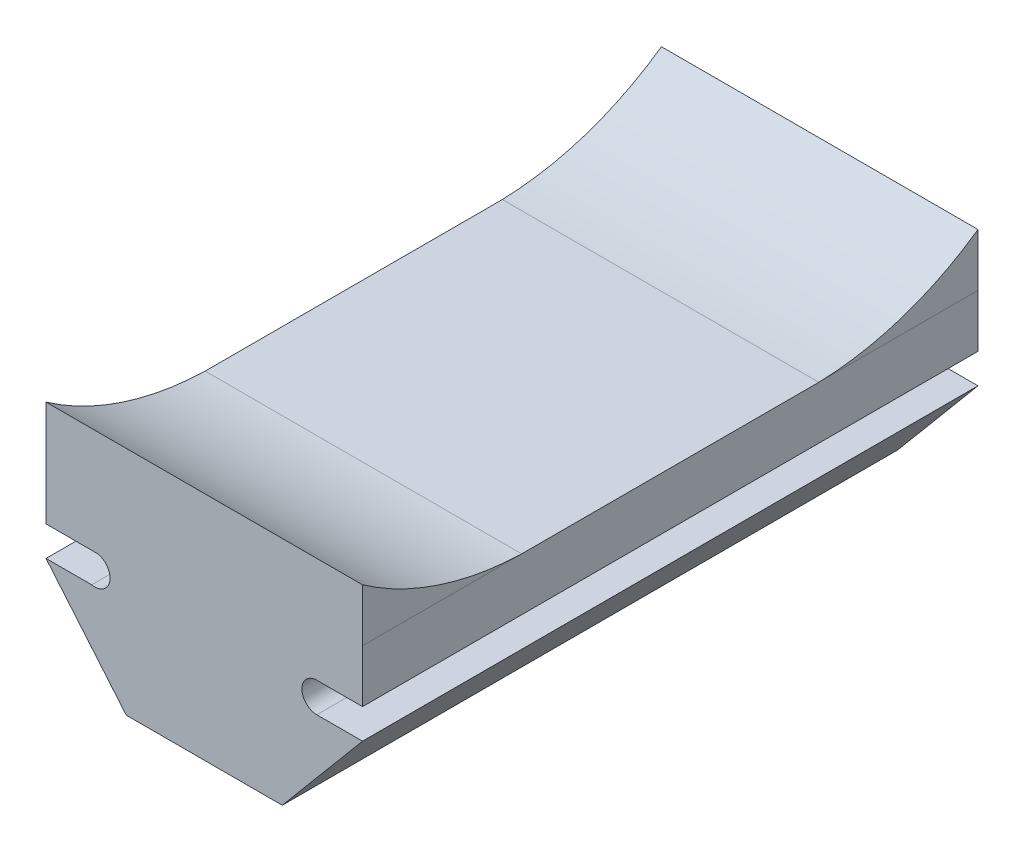
ISO-10303-21;
HEADER;
FILE_DESCRIPTION(('STEP AP214'),'2;1');
FILE_NAME('part.step','',(''),(''),'','','');
FILE_SCHEMA(('AUTOMOTIVE_DESIGN { 1 0 10303 214 1 1 1 1 }'));
ENDSEC;
DATA;
#1=APPLICATION_CONTEXT('core data for automotive mechanical design processes');
#2=APPLICATION_PROTOCOL_DEFINITION('international standard','automotive_design',2000,#1);
#3=PRODUCT_CONTEXT('',#1,'mechanical');
#4=PRODUCT('Part','Part','',(#3));
#5=PRODUCT_RELATED_PRODUCT_CATEGORY('part','',(#4));
#6=PRODUCT_DEFINITION_FORMATION('','',#4);
#7=PRODUCT_DEFINITION_CONTEXT('part definition',#1,'design');
#8=PRODUCT_DEFINITION('design','',#6,#7);
#9=PRODUCT_DEFINITION_SHAPE('','',#8);
#10=(LENGTH_UNIT() NAMED_UNIT(*) SI_UNIT(.MILLI.,.METRE.));
#11=(NAMED_UNIT(*) PLANE_ANGLE_UNIT() SI_UNIT($,.RADIAN.));
#12=(NAMED_UNIT(*) SI_UNIT($,.STERADIAN.) SOLID_ANGLE_UNIT());
#13=UNCERTAINTY_MEASURE_WITH_UNIT(LENGTH_MEASURE(1.E-05),#10,'distance_accuracy_value','');
#14=(GEOMETRIC_REPRESENTATION_CONTEXT(3) GLOBAL_UNCERTAINTY_ASSIGNED_CONTEXT((#13)) GLOBAL_UNIT_ASSIGNED_CONTEXT((#10,
#11,#12)) REPRESENTATION_CONTEXT('',''));
#15=CARTESIAN_POINT('',(0.,0.,0.));
#16=DIRECTION('',(0.,0.,1.));
#17=DIRECTION('',(1.,0.,0.));
#18=AXIS2_PLACEMENT_3D('',#15,#16,#17);
#19=CARTESIAN_POINT('',(0.,6.26896551724138,70.));
#20=DIRECTION('',(0.,1.,0.));
#21=DIRECTION('',(0.,0.,1.));
#22=AXIS2_PLACEMENT_3D('',#19,#20,#21);
#23=PLANE('',#22);
#24=DIRECTION('',(1.,0.,0.));
#25=VECTOR('',#24,1.);
#26=CARTESIAN_POINT('',(-7.63448275862069,6.26896551724138,18.0996309277764));
#27=LINE('',#26,#25);
#28=CARTESIAN_POINT('',(-7.63448275862069,6.26896551724138,18.0996309277764));
#29=VERTEX_POINT('',#28);
#30=CARTESIAN_POINT('',(28.3655172413793,6.26896551724138,18.0996309277764));
#31=VERTEX_POINT('',#30);
#32=EDGE_CURVE('E304',#29,#31,#27,.T.);
#33=ORIENTED_EDGE('',*,*,#32,.F.);
#34=DIRECTION('',(0.,0.,-1.));
#35=VECTOR('',#34,1.);
#36=CARTESIAN_POINT('',(-7.63448275862069,6.26896551724138,70.));
#37=LINE('',#36,#35);
#38=CARTESIAN_POINT('',(-7.63448275862069,6.26896551724138,51.9003690722241));
#39=VERTEX_POINT('',#38);
#40=EDGE_CURVE('E203',#39,#29,#37,.T.);
#41=ORIENTED_EDGE('',*,*,#40,.F.);
#42=DIRECTION('',(1.,0.,0.));
#43=VECTOR('',#42,1.);
#44=CARTESIAN_POINT('',(-7.63448275862069,6.26896551724138,51.9003690722241));
#45=LINE('',#44,#43);
#46=CARTESIAN_POINT('',(28.3655172413793,6.26896551724138,51.9003690722241));
#47=VERTEX_POINT('',#46);
#48=EDGE_CURVE('E167',#39,#47,#45,.T.);
#49=ORIENTED_EDGE('',*,*,#48,.T.);
#50=DIRECTION('',(0.,0.,-1.));
#51=VECTOR('',#50,1.);
#52=CARTESIAN_POINT('',(28.3655172413793,6.26896551724138,70.));
#53=LINE('',#52,#51);
#54=EDGE_CURVE('E206',#47,#31,#53,.T.);
#55=ORIENTED_EDGE('',*,*,#54,.T.);
#56=EDGE_LOOP('',(#33,#41,#49,#55));
#57=FACE_BOUND('',#56,.T.);
#58=ADVANCED_FACE('F39',(#57),#23,.T.);
#59=CARTESIAN_POINT('',(23.1655172413793,-1.43103448275862,70.));
#60=DIRECTION('',(0.,0.,-1.));
#61=DIRECTION('',(-1.,0.,0.));
#62=AXIS2_PLACEMENT_3D('',#59,#60,#61);
#63=CYLINDRICAL_SURFACE('',#62,1.7);
#64=CARTESIAN_POINT('',(23.1655172413793,-1.43103448275862,0.));
#65=DIRECTION('',(0.,0.,1.));
#66=DIRECTION('',(1.,0.,0.));
#67=AXIS2_PLACEMENT_3D('',#64,#65,#66);
#68=CIRCLE('',#67,1.7);
#69=CARTESIAN_POINT('',(23.1655172413793,0.268965517241379,0.));
#70=VERTEX_POINT('',#69);
#71=CARTESIAN_POINT('',(23.1655172413793,-3.13103448275862,0.));
#72=VERTEX_POINT('',#71);
#73=EDGE_CURVE('E164',#70,#72,#68,.T.);
#74=ORIENTED_EDGE('',*,*,#73,.F.);
#75=DIRECTION('',(0.,0.,-1.));
#76=VECTOR('',#75,1.);
#77=CARTESIAN_POINT('',(23.1655172413793,0.268965517241379,70.));
#78=LINE('',#77,#76);
#79=CARTESIAN_POINT('',(23.1655172413793,0.268965517241379,70.));
#80=VERTEX_POINT('',#79);
#81=EDGE_CURVE('E11',#80,#70,#78,.T.);
#82=ORIENTED_EDGE('',*,*,#81,.F.);
#83=CARTESIAN_POINT('',(23.1655172413793,-1.43103448275862,70.));
#84=DIRECTION('',(0.,0.,1.));
#85=DIRECTION('',(1.,0.,0.));
#86=AXIS2_PLACEMENT_3D('',#83,#84,#85);
#87=CIRCLE('',#86,1.7);
#88=CARTESIAN_POINT('',(23.1655172413793,-3.13103448275862,70.));
#89=VERTEX_POINT('',#88);
#90=EDGE_CURVE('E189',#80,#89,#87,.T.);
#91=ORIENTED_EDGE('',*,*,#90,.T.);
#92=DIRECTION('',(0.,0.,-1.));
#93=VECTOR('',#92,1.);
#94=CARTESIAN_POINT('',(23.1655172413793,-3.13103448275862,70.));
#95=LINE('',#94,#93);
#96=EDGE_CURVE('E65',#89,#72,#95,.T.);
#97=ORIENTED_EDGE('',*,*,#96,.T.);
#98=EDGE_LOOP('',(#74,#82,#91,#97));
#99=FACE_BOUND('',#98,.T.);
#100=ADVANCED_FACE('F41',(#99),#63,.F.);
#101=CARTESIAN_POINT('',(0.,0.268965517241376,70.));
#102=DIRECTION('',(0.,-1.,0.));
#103=DIRECTION('',(1.,0.,0.));
#104=AXIS2_PLACEMENT_3D('',#101,#102,#103);
#105=PLANE('',#104);
#106=DIRECTION('',(-1.,0.,0.));
#107=VECTOR('',#106,1.);
#108=CARTESIAN_POINT('',(0.,0.268965517241376,0.));
#109=LINE('',#108,#107);
#110=CARTESIAN_POINT('',(28.3655172413793,0.268965517241379,0.));
#111=VERTEX_POINT('',#110);
#112=EDGE_CURVE('E166',#111,#70,#109,.T.);
#113=ORIENTED_EDGE('',*,*,#112,.F.);
#114=DIRECTION('',(0.,0.,-1.));
#115=VECTOR('',#114,1.);
#116=CARTESIAN_POINT('',(28.3655172413793,0.268965517241379,70.));
#117=LINE('',#116,#115);
#118=CARTESIAN_POINT('',(28.3655172413793,0.268965517241379,70.));
#119=VERTEX_POINT('',#118);
#120=EDGE_CURVE('E48',#119,#111,#117,.T.);
#121=ORIENTED_EDGE('',*,*,#120,.F.);
#122=DIRECTION('',(-1.,0.,0.));
#123=VECTOR('',#122,1.);
#124=CARTESIAN_POINT('',(0.,0.268965517241376,70.));
#125=LINE('',#124,#123);
#126=EDGE_CURVE('E262',#119,#80,#125,.T.);
#127=ORIENTED_EDGE('',*,*,#126,.T.);
#128=ORIENTED_EDGE('',*,*,#81,.T.);
#129=EDGE_LOOP('',(#113,#121,#127,#128));
#130=FACE_BOUND('',#129,.T.);
#131=ADVANCED_FACE('F235',(#130),#105,.T.);
#132=CARTESIAN_POINT('',(28.3655172413793,0.,70.));
#133=DIRECTION('',(1.,0.,0.));
#134=DIRECTION('',(0.,0.,-1.));
#135=AXIS2_PLACEMENT_3D('',#132,#133,#134);
#136=PLANE('',#135);
#137=DIRECTION('',(0.,-1.,0.));
#138=VECTOR('',#137,1.);
#139=CARTESIAN_POINT('',(28.3655172413793,0.,0.));
#140=LINE('',#139,#138);
#141=CARTESIAN_POINT('',(28.3655232413793,6.26896551724138,0.));
#142=VERTEX_POINT('',#141);
#143=EDGE_CURVE('E170',#142,#111,#140,.T.);
#144=ORIENTED_EDGE('',*,*,#143,.F.);
#145=CARTESIAN_POINT('',(28.3655172413793,6.26896551724138,0.));
#146=DIRECTION('',(0.,0.,1.));
#147=VECTOR('',#146,1.);
#148=LINE('',#145,#147);
#149=EDGE_CURVE('E258',#142,#31,#148,.T.);
#150=ORIENTED_EDGE('',*,*,#149,.T.);
#151=ORIENTED_EDGE('',*,*,#54,.F.);
#152=CARTESIAN_POINT('',(28.3655292413793,6.26896551724138,70.));
#153=DIRECTION('',(0.,0.,-1.));
#154=VECTOR('',#153,1.);
#155=LINE('',#152,#154);
#156=CARTESIAN_POINT('',(28.3655232413793,6.26896551724138,70.));
#157=VERTEX_POINT('',#156);
#158=EDGE_CURVE('E212',#157,#47,#155,.T.);
#159=ORIENTED_EDGE('',*,*,#158,.F.);
#160=DIRECTION('',(0.,-1.,0.));
#161=VECTOR('',#160,1.);
#162=CARTESIAN_POINT('',(28.3655172413793,0.,70.));
#163=LINE('',#162,#161);
#164=EDGE_CURVE('E223',#157,#119,#163,.T.);
#165=ORIENTED_EDGE('',*,*,#164,.T.);
#166=ORIENTED_EDGE('',*,*,#120,.T.);
#167=EDGE_LOOP('',(#144,#150,#151,#159,#165,#166));
#168=FACE_BOUND('',#167,.T.);
#169=ADVANCED_FACE('F225',(#168),#136,.T.);
#170=CARTESIAN_POINT('',(-7.63448275862069,0.,70.));
#171=DIRECTION('',(1.,0.,0.));
#172=DIRECTION('',(0.,0.,-1.));
#173=AXIS2_PLACEMENT_3D('',#170,#171,#172);
#174=PLANE('',#173);
#175=DIRECTION('',(0.,-1.,0.));
#176=VECTOR('',#175,1.);
#177=CARTESIAN_POINT('',(-7.63448275862069,0.,0.));
#178=LINE('',#177,#176);
#179=CARTESIAN_POINT('',(-7.63448275862069,12.2689655172414,0.));
#180=VERTEX_POINT('',#179);
#181=CARTESIAN_POINT('',(-7.63448275862069,0.268965517241379,0.));
#182=VERTEX_POINT('',#181);
#183=EDGE_CURVE('E171',#180,#182,#178,.T.);
#184=ORIENTED_EDGE('',*,*,#183,.T.);
#185=DIRECTION('',(0.,0.,-1.));
#186=VECTOR('',#185,1.);
#187=CARTESIAN_POINT('',(-7.63448275862069,0.268965517241379,70.));
#188=LINE('',#187,#186);
#189=CARTESIAN_POINT('',(-7.63448275862069,0.268965517241379,70.));
#190=VERTEX_POINT('',#189);
#191=EDGE_CURVE('E200',#190,#182,#188,.T.);
#192=ORIENTED_EDGE('',*,*,#191,.F.);
#193=DIRECTION('',(0.,-1.,0.));
#194=VECTOR('',#193,1.);
#195=CARTESIAN_POINT('',(-7.63448275862069,0.,70.));
#196=LINE('',#195,#194);
#197=CARTESIAN_POINT('',(-7.63448275862069,12.2689655172414,70.));
#198=VERTEX_POINT('',#197);
#199=EDGE_CURVE('E290',#198,#190,#196,.T.);
#200=ORIENTED_EDGE('',*,*,#199,.F.);
#201=CARTESIAN_POINT('',(-7.63448275862069,39.4160357470609,50.9564768135235));
#202=DIRECTION('',(1.,0.,0.));
#203=DIRECTION('',(0.,0.,-1.));
#204=AXIS2_PLACEMENT_3D('',#201,#202,#203);
#205=CIRCLE('',#204,33.1605065916766);
#206=EDGE_CURVE('E369',#198,#39,#205,.T.);
#207=ORIENTED_EDGE('',*,*,#206,.T.);
#208=ORIENTED_EDGE('',*,*,#40,.T.);
#209=CARTESIAN_POINT('',(-7.63448275862069,39.416035747061,19.0435231864765));
#210=DIRECTION('',(1.,0.,0.));
#211=DIRECTION('',(0.,0.,-1.));
#212=AXIS2_PLACEMENT_3D('',#209,#210,#211);
#213=CIRCLE('',#212,33.1605065916766);
#214=EDGE_CURVE('E294',#180,#29,#213,.F.);
#215=ORIENTED_EDGE('',*,*,#214,.F.);
#216=EDGE_LOOP('',(#184,#192,#200,#207,#208,#215));
#217=FACE_BOUND('',#216,.T.);
#218=ADVANCED_FACE('F234',(#217),#174,.F.);
#219=CARTESIAN_POINT('',(0.,0.268965517241379,70.));
#220=DIRECTION('',(0.,1.,0.));
#221=DIRECTION('',(0.,0.,1.));
#222=AXIS2_PLACEMENT_3D('',#219,#220,#221);
#223=PLANE('',#222);
#224=DIRECTION('',(1.,0.,0.));
#225=VECTOR('',#224,1.);
#226=CARTESIAN_POINT('',(0.,0.268965517241379,0.));
#227=LINE('',#226,#225);
#228=CARTESIAN_POINT('',(-1.73448275862069,0.268965517241379,0.));
#229=VERTEX_POINT('',#228);
#230=EDGE_CURVE('E173',#182,#229,#227,.T.);
#231=ORIENTED_EDGE('',*,*,#230,.T.);
#232=DIRECTION('',(0.,0.,-1.));
#233=VECTOR('',#232,1.);
#234=CARTESIAN_POINT('',(-1.73448275862069,0.268965517241379,70.));
#235=LINE('',#234,#233);
#236=CARTESIAN_POINT('',(-1.73448275862069,0.268965517241379,70.));
#237=VERTEX_POINT('',#236);
#238=EDGE_CURVE('E197',#237,#229,#235,.T.);
#239=ORIENTED_EDGE('',*,*,#238,.F.);
#240=DIRECTION('',(1.,0.,0.));
#241=VECTOR('',#240,1.);
#242=CARTESIAN_POINT('',(0.,0.268965517241379,70.));
#243=LINE('',#242,#241);
#244=EDGE_CURVE('E285',#190,#237,#243,.T.);
#245=ORIENTED_EDGE('',*,*,#244,.F.);
#246=ORIENTED_EDGE('',*,*,#191,.T.);
#247=EDGE_LOOP('',(#231,#239,#245,#246));
#248=FACE_BOUND('',#247,.T.);
#249=ADVANCED_FACE('F282',(#248),#223,.F.);
#250=CARTESIAN_POINT('',(-2.08448275862069,-1.43103448275862,70.));
#251=DIRECTION('',(0.,0.,-1.));
#252=DIRECTION('',(-1.,0.,0.));
#253=AXIS2_PLACEMENT_3D('',#250,#251,#252);
#254=CYLINDRICAL_SURFACE('',#253,1.73565549577098);
#255=CARTESIAN_POINT('',(-2.08448275862069,-1.43103448275862,0.));
#256=DIRECTION('',(0.,0.,1.));
#257=DIRECTION('',(1.,0.,0.));
#258=AXIS2_PLACEMENT_3D('',#255,#256,#257);
#259=CIRCLE('',#258,1.73565549577098);
#260=CARTESIAN_POINT('',(-2.43448275862069,-3.13103448275862,0.));
#261=VERTEX_POINT('',#260);
#262=EDGE_CURVE('E175',#229,#261,#259,.F.);
#263=ORIENTED_EDGE('',*,*,#262,.T.);
#264=DIRECTION('',(0.,0.,-1.));
#265=VECTOR('',#264,1.);
#266=CARTESIAN_POINT('',(-2.43448275862069,-3.13103448275862,70.));
#267=LINE('',#266,#265);
#268=CARTESIAN_POINT('',(-2.43448275862069,-3.13103448275862,70.));
#269=VERTEX_POINT('',#268);
#270=EDGE_CURVE('E195',#269,#261,#267,.T.);
#271=ORIENTED_EDGE('',*,*,#270,.F.);
#272=CARTESIAN_POINT('',(-2.08448275862069,-1.43103448275862,70.));
#273=DIRECTION('',(0.,0.,1.));
#274=DIRECTION('',(1.,0.,0.));
#275=AXIS2_PLACEMENT_3D('',#272,#273,#274);
#276=CIRCLE('',#275,1.73565549577098);
#277=EDGE_CURVE('E361',#237,#269,#276,.F.);
#278=ORIENTED_EDGE('',*,*,#277,.F.);
#279=ORIENTED_EDGE('',*,*,#238,.T.);
#280=EDGE_LOOP('',(#263,#271,#278,#279));
#281=FACE_BOUND('',#280,.T.);
#282=ADVANCED_FACE('F275',(#281),#254,.F.);
#283=CARTESIAN_POINT('',(0.,-3.13103448275862,70.));
#284=DIRECTION('',(0.,1.,0.));
#285=DIRECTION('',(0.,0.,1.));
#286=AXIS2_PLACEMENT_3D('',#283,#284,#285);
#287=PLANE('',#286);
#288=DIRECTION('',(1.,0.,0.));
#289=VECTOR('',#288,1.);
#290=CARTESIAN_POINT('',(0.,-3.13103448275862,0.));
#291=LINE('',#290,#289);
#292=CARTESIAN_POINT('',(-7.63448275862069,-3.13103448275862,0.));
#293=VERTEX_POINT('',#292);
#294=EDGE_CURVE('E178',#293,#261,#291,.T.);
#295=ORIENTED_EDGE('',*,*,#294,.F.);
#296=DIRECTION('',(0.,0.,-1.));
#297=VECTOR('',#296,1.);
#298=CARTESIAN_POINT('',(-7.63448275862069,-3.13103448275862,70.));
#299=LINE('',#298,#297);
#300=CARTESIAN_POINT('',(-7.63448275862069,-3.13103448275862,70.));
#301=VERTEX_POINT('',#300);
#302=EDGE_CURVE('E193',#301,#293,#299,.T.);
#303=ORIENTED_EDGE('',*,*,#302,.F.);
#304=DIRECTION('',(1.,0.,0.));
#305=VECTOR('',#304,1.);
#306=CARTESIAN_POINT('',(0.,-3.13103448275862,70.));
#307=LINE('',#306,#305);
#308=EDGE_CURVE('E272',#301,#269,#307,.T.);
#309=ORIENTED_EDGE('',*,*,#308,.T.);
#310=ORIENTED_EDGE('',*,*,#270,.T.);
#311=EDGE_LOOP('',(#295,#303,#309,#310));
#312=FACE_BOUND('',#311,.T.);
#313=ADVANCED_FACE('F269',(#312),#287,.T.);
#314=CARTESIAN_POINT('',(-6.02183190532703,-5.05291693077147,70.));
#315=DIRECTION('',(0.766044443118979,0.642787609686538,0.));
#316=DIRECTION('',(-0.642787609686538,0.766044443118979,0.));
#317=AXIS2_PLACEMENT_3D('',#314,#315,#316);
#318=PLANE('',#317);
#319=DIRECTION('',(0.642787609686538,-0.766044443118979,0.));
#320=VECTOR('',#319,1.);
#321=CARTESIAN_POINT('',(-6.02183190532703,-5.05291693077147,0.));
#322=LINE('',#321,#320);
#323=CARTESIAN_POINT('',(1.49310129892814,-14.0088655750481,0.));
#324=VERTEX_POINT('',#323);
#325=EDGE_CURVE('E181',#293,#324,#322,.T.);
#326=ORIENTED_EDGE('',*,*,#325,.T.);
#327=DIRECTION('',(0.,0.,-1.));
#328=VECTOR('',#327,1.);
#329=CARTESIAN_POINT('',(1.49310129892814,-14.0088655750481,70.));
#330=LINE('',#329,#328);
#331=CARTESIAN_POINT('',(1.49310129892814,-14.0088655750481,70.));
#332=VERTEX_POINT('',#331);
#333=EDGE_CURVE('E155',#332,#324,#330,.T.);
#334=ORIENTED_EDGE('',*,*,#333,.F.);
#335=DIRECTION('',(0.642787609686538,-0.766044443118979,0.));
#336=VECTOR('',#335,1.);
#337=CARTESIAN_POINT('',(-6.02183190532703,-5.05291693077147,70.));
#338=LINE('',#337,#336);
#339=EDGE_CURVE('E142',#301,#332,#338,.T.);
#340=ORIENTED_EDGE('',*,*,#339,.F.);
#341=ORIENTED_EDGE('',*,*,#302,.T.);
#342=EDGE_LOOP('',(#326,#334,#340,#341));
#343=FACE_BOUND('',#342,.T.);
#344=ADVANCED_FACE('F425',(#343),#318,.F.);
#345=CARTESIAN_POINT('',(0.,-14.0088655750481,70.));
#346=DIRECTION('',(0.,1.,0.));
#347=DIRECTION('',(-1.,0.,0.));
#348=AXIS2_PLACEMENT_3D('',#345,#346,#347);
#349=PLANE('',#348);
#350=DIRECTION('',(1.,0.,0.));
#351=VECTOR('',#350,1.);
#352=CARTESIAN_POINT('',(0.,-14.0088655750481,0.));
#353=LINE('',#352,#351);
#354=CARTESIAN_POINT('',(19.2379331838305,-14.0088655750481,0.));
#355=VERTEX_POINT('',#354);
#356=EDGE_CURVE('E151',#324,#355,#353,.T.);
#357=ORIENTED_EDGE('',*,*,#356,.T.);
#358=DIRECTION('',(0.,0.,-1.));
#359=VECTOR('',#358,1.);
#360=CARTESIAN_POINT('',(19.2379331838305,-14.0088655750481,70.));
#361=LINE('',#360,#359);
#362=CARTESIAN_POINT('',(19.2379331838305,-14.0088655750481,70.));
#363=VERTEX_POINT('',#362);
#364=EDGE_CURVE('E148',#363,#355,#361,.T.);
#365=ORIENTED_EDGE('',*,*,#364,.F.);
#366=DIRECTION('',(1.,0.,0.));
#367=VECTOR('',#366,1.);
#368=CARTESIAN_POINT('',(0.,-14.0088655750481,70.));
#369=LINE('',#368,#367);
#370=EDGE_CURVE('E134',#332,#363,#369,.T.);
#371=ORIENTED_EDGE('',*,*,#370,.F.);
#372=ORIENTED_EDGE('',*,*,#333,.T.);
#373=EDGE_LOOP('',(#357,#365,#371,#372));
#374=FACE_BOUND('',#373,.T.);
#375=ADVANCED_FACE('F149',(#374),#349,.F.);
#376=CARTESIAN_POINT('',(18.187302326247,-15.2609586740635,70.));
#377=DIRECTION('',(0.766044443118979,-0.642787609686538,0.));
#378=DIRECTION('',(0.642787609686538,0.766044443118979,0.));
#379=AXIS2_PLACEMENT_3D('',#376,#377,#378);
#380=PLANE('',#379);
#381=DIRECTION('',(-0.642787609686538,-0.766044443118979,0.));
#382=VECTOR('',#381,1.);
#383=CARTESIAN_POINT('',(18.187302326247,-15.2609586740635,0.));
#384=LINE('',#383,#382);
#385=CARTESIAN_POINT('',(28.3655172413793,-3.13103448275862,0.));
#386=VERTEX_POINT('',#385);
#387=EDGE_CURVE('E184',#386,#355,#384,.T.);
#388=ORIENTED_EDGE('',*,*,#387,.F.);
#389=DIRECTION('',(0.,0.,-1.));
#390=VECTOR('',#389,1.);
#391=CARTESIAN_POINT('',(28.3655172413793,-3.13103448275862,70.));
#392=LINE('',#391,#390);
#393=CARTESIAN_POINT('',(28.3655172413793,-3.13103448275862,70.));
#394=VERTEX_POINT('',#393);
#395=EDGE_CURVE('E156',#394,#386,#392,.T.);
#396=ORIENTED_EDGE('',*,*,#395,.F.);
#397=DIRECTION('',(-0.642787609686538,-0.766044443118979,0.));
#398=VECTOR('',#397,1.);
#399=CARTESIAN_POINT('',(18.187302326247,-15.2609586740635,70.));
#400=LINE('',#399,#398);
#401=EDGE_CURVE('E139',#394,#363,#400,.T.);
#402=ORIENTED_EDGE('',*,*,#401,.T.);
#403=ORIENTED_EDGE('',*,*,#364,.T.);
#404=EDGE_LOOP('',(#388,#396,#402,#403));
#405=FACE_BOUND('',#404,.T.);
#406=ADVANCED_FACE('F158',(#405),#380,.T.);
#407=CARTESIAN_POINT('',(0.,-3.13103448275862,70.));
#408=DIRECTION('',(0.,1.,0.));
#409=DIRECTION('',(-1.,0.,0.));
#410=AXIS2_PLACEMENT_3D('',#407,#408,#409);
#411=PLANE('',#410);
#412=DIRECTION('',(1.,0.,0.));
#413=VECTOR('',#412,1.);
#414=CARTESIAN_POINT('',(0.,-3.13103448275862,0.));
#415=LINE('',#414,#413);
#416=EDGE_CURVE('E186',#72,#386,#415,.T.);
#417=ORIENTED_EDGE('',*,*,#416,.F.);
#418=ORIENTED_EDGE('',*,*,#96,.F.);
#419=DIRECTION('',(1.,0.,0.));
#420=VECTOR('',#419,1.);
#421=CARTESIAN_POINT('',(0.,-3.13103448275862,70.));
#422=LINE('',#421,#420);
#423=EDGE_CURVE('E159',#89,#394,#422,.T.);
#424=ORIENTED_EDGE('',*,*,#423,.T.);
#425=ORIENTED_EDGE('',*,*,#395,.T.);
#426=EDGE_LOOP('',(#417,#418,#424,#425));
#427=FACE_BOUND('',#426,.T.);
#428=ADVANCED_FACE('F263',(#427),#411,.T.);
#429=CARTESIAN_POINT('',(0.,0.,70.));
#430=DIRECTION('',(0.,0.,1.));
#431=DIRECTION('',(1.,0.,0.));
#432=AXIS2_PLACEMENT_3D('',#429,#430,#431);
#433=PLANE('',#432);
#434=ORIENTED_EDGE('',*,*,#90,.F.);
#435=ORIENTED_EDGE('',*,*,#126,.F.);
#436=ORIENTED_EDGE('',*,*,#164,.F.);
#437=DIRECTION('',(0.,1.,0.));
#438=VECTOR('',#437,1.);
#439=CARTESIAN_POINT('',(28.3655292413793,0.,70.));
#440=LINE('',#439,#438);
#441=CARTESIAN_POINT('',(28.3655232413793,12.2689655172414,70.));
#442=VERTEX_POINT('',#441);
#443=EDGE_CURVE('E325',#157,#442,#440,.T.);
#444=ORIENTED_EDGE('',*,*,#443,.T.);
#445=DIRECTION('',(1.,0.,0.));
#446=VECTOR('',#445,1.);
#447=CARTESIAN_POINT('',(-7.63448275862069,12.2689655172414,70.));
#448=LINE('',#447,#446);
#449=EDGE_CURVE('E364',#198,#442,#448,.T.);
#450=ORIENTED_EDGE('',*,*,#449,.F.);
#451=ORIENTED_EDGE('',*,*,#199,.T.);
#452=ORIENTED_EDGE('',*,*,#244,.T.);
#453=ORIENTED_EDGE('',*,*,#277,.T.);
#454=ORIENTED_EDGE('',*,*,#308,.F.);
#455=ORIENTED_EDGE('',*,*,#339,.T.);
#456=ORIENTED_EDGE('',*,*,#370,.T.);
#457=ORIENTED_EDGE('',*,*,#401,.F.);
#458=ORIENTED_EDGE('',*,*,#423,.F.);
#459=EDGE_LOOP('',(#434,#435,#436,#444,#450,#451,#452,#453,#454,#455,#456,#457,#458));
#460=FACE_BOUND('',#459,.T.);
#461=ADVANCED_FACE('F136',(#460),#433,.T.);
#462=CARTESIAN_POINT('',(0.,0.,0.));
#463=DIRECTION('',(0.,0.,1.));
#464=DIRECTION('',(1.,0.,0.));
#465=AXIS2_PLACEMENT_3D('',#462,#463,#464);
#466=PLANE('',#465);
#467=ORIENTED_EDGE('',*,*,#73,.T.);
#468=ORIENTED_EDGE('',*,*,#416,.T.);
#469=ORIENTED_EDGE('',*,*,#387,.T.);
#470=ORIENTED_EDGE('',*,*,#356,.F.);
#471=ORIENTED_EDGE('',*,*,#325,.F.);
#472=ORIENTED_EDGE('',*,*,#294,.T.);
#473=ORIENTED_EDGE('',*,*,#262,.F.);
#474=ORIENTED_EDGE('',*,*,#230,.F.);
#475=ORIENTED_EDGE('',*,*,#183,.F.);
#476=DIRECTION('',(1.,0.,0.));
#477=VECTOR('',#476,1.);
#478=CARTESIAN_POINT('',(-7.63448275862069,12.2689655172414,0.));
#479=LINE('',#478,#477);
#480=CARTESIAN_POINT('',(28.3655232413793,12.2689655172414,0.));
#481=VERTEX_POINT('',#480);
#482=EDGE_CURVE('E301',#180,#481,#479,.T.);
#483=ORIENTED_EDGE('',*,*,#482,.T.);
#484=DIRECTION('',(0.,1.,0.));
#485=VECTOR('',#484,1.);
#486=CARTESIAN_POINT('',(28.3655292413793,0.,0.));
#487=LINE('',#486,#485);
#488=EDGE_CURVE('E256',#142,#481,#487,.T.);
#489=ORIENTED_EDGE('',*,*,#488,.F.);
#490=ORIENTED_EDGE('',*,*,#143,.T.);
#491=ORIENTED_EDGE('',*,*,#112,.T.);
#492=EDGE_LOOP('',(#467,#468,#469,#470,#471,#472,#473,#474,#475,#483,#489,#490,#491));
#493=FACE_BOUND('',#492,.T.);
#494=ADVANCED_FACE('F252',(#493),#466,.F.);
#495=CARTESIAN_POINT('',(-7.63448275862069,39.4160357470609,50.9564768135235));
#496=DIRECTION('',(1.,0.,0.));
#497=DIRECTION('',(0.,0.,-1.));
#498=AXIS2_PLACEMENT_3D('',#495,#496,#497);
#499=CYLINDRICAL_SURFACE('',#498,33.1605065916766);
#500=CARTESIAN_POINT('',(28.3655292413793,39.4160357470609,50.9564768135235));
#501=DIRECTION('',(1.,0.,0.));
#502=DIRECTION('',(0.,0.,-1.));
#503=AXIS2_PLACEMENT_3D('',#500,#501,#502);
#504=CIRCLE('',#503,33.1605065916766);
#505=EDGE_CURVE('E56',#442,#47,#504,.T.);
#506=ORIENTED_EDGE('',*,*,#505,.T.);
#507=ORIENTED_EDGE('',*,*,#48,.F.);
#508=ORIENTED_EDGE('',*,*,#206,.F.);
#509=ORIENTED_EDGE('',*,*,#449,.T.);
#510=EDGE_LOOP('',(#506,#507,#508,#509));
#511=FACE_BOUND('',#510,.T.);
#512=ADVANCED_FACE('F343',(#511),#499,.F.);
#513=CARTESIAN_POINT('',(28.3655292413793,0.,0.));
#514=DIRECTION('',(1.,0.,0.));
#515=DIRECTION('',(0.,0.,-1.));
#516=AXIS2_PLACEMENT_3D('',#513,#514,#515);
#517=PLANE('',#516);
#518=ORIENTED_EDGE('',*,*,#505,.F.);
#519=ORIENTED_EDGE('',*,*,#443,.F.);
#520=ORIENTED_EDGE('',*,*,#158,.T.);
#521=EDGE_LOOP('',(#518,#519,#520));
#522=FACE_BOUND('',#521,.T.);
#523=ADVANCED_FACE('F339',(#522),#517,.T.);
#524=CARTESIAN_POINT('',(-7.63448275862069,39.416035747061,19.0435231864765));
#525=DIRECTION('',(1.,0.,0.));
#526=DIRECTION('',(0.,0.,-1.));
#527=AXIS2_PLACEMENT_3D('',#524,#525,#526);
#528=CYLINDRICAL_SURFACE('',#527,33.1605065916766);
#529=CARTESIAN_POINT('',(28.3655292413793,39.416035747061,19.0435231864765));
#530=DIRECTION('',(1.,0.,0.));
#531=DIRECTION('',(0.,0.,-1.));
#532=AXIS2_PLACEMENT_3D('',#529,#530,#531);
#533=CIRCLE('',#532,33.1605065916766);
#534=EDGE_CURVE('E302',#481,#31,#533,.F.);
#535=ORIENTED_EDGE('',*,*,#534,.F.);
#536=ORIENTED_EDGE('',*,*,#482,.F.);
#537=ORIENTED_EDGE('',*,*,#214,.T.);
#538=ORIENTED_EDGE('',*,*,#32,.T.);
#539=EDGE_LOOP('',(#535,#536,#537,#538));
#540=FACE_BOUND('',#539,.T.);
#541=ADVANCED_FACE('F336',(#540),#528,.F.);
#542=CARTESIAN_POINT('',(28.3655292413793,0.,0.));
#543=DIRECTION('',(1.,0.,0.));
#544=DIRECTION('',(0.,0.,-1.));
#545=AXIS2_PLACEMENT_3D('',#542,#543,#544);
#546=PLANE('',#545);
#547=ORIENTED_EDGE('',*,*,#488,.T.);
#548=ORIENTED_EDGE('',*,*,#534,.T.);
#549=ORIENTED_EDGE('',*,*,#149,.F.);
#550=EDGE_LOOP('',(#547,#548,#549));
#551=FACE_BOUND('',#550,.T.);
#552=ADVANCED_FACE('F327',(#551),#546,.T.);
#553=CLOSED_SHELL('',(#58,#100,#131,#169,#218,#249,#282,#313,#344,#375,#406,#428,#461,#494,#512,
#523,#541,#552));
#554=MANIFOLD_SOLID_BREP('B2',#553);
#555=ADVANCED_BREP_SHAPE_REPRESENTATION('',(#18,#554),#14);
#556=SHAPE_DEFINITION_REPRESENTATION(#9,#555);
ENDSEC;
END-ISO-10303-21;
